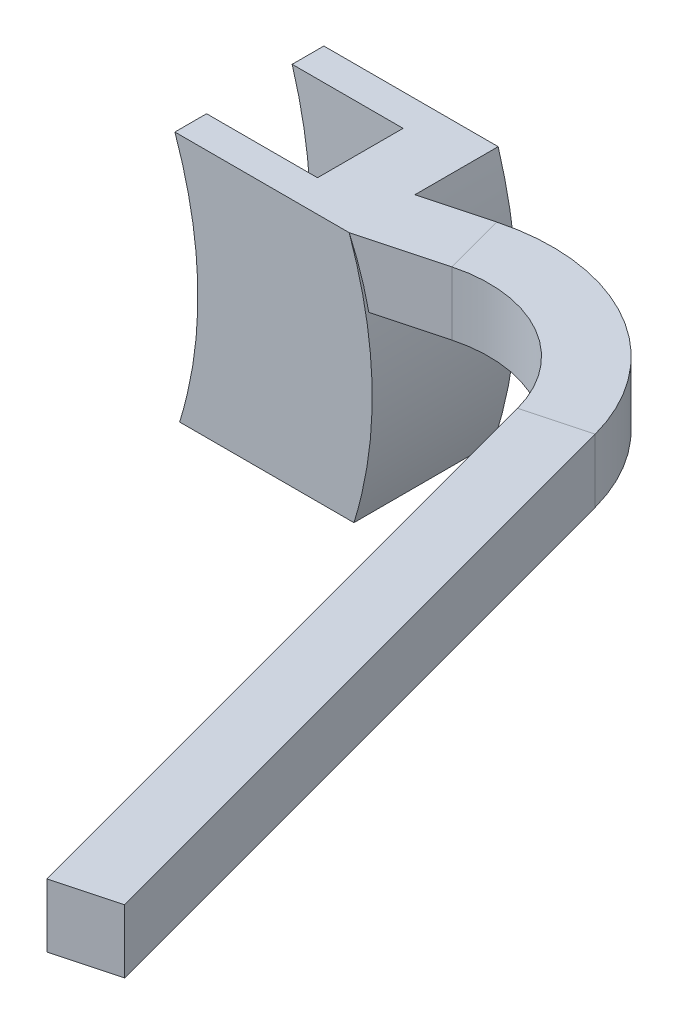
ISO-10303-21;
HEADER;
FILE_DESCRIPTION(('STEP AP214'),'2;1');
FILE_NAME('part.step','',(''),(''),'','','');
FILE_SCHEMA(('AUTOMOTIVE_DESIGN { 1 0 10303 214 1 1 1 1 }'));
ENDSEC;
DATA;
#1=APPLICATION_CONTEXT('core data for automotive mechanical design processes');
#2=APPLICATION_PROTOCOL_DEFINITION('international standard','automotive_design',2000,#1);
#3=PRODUCT_CONTEXT('',#1,'mechanical');
#4=PRODUCT('Part','Part','',(#3));
#5=PRODUCT_RELATED_PRODUCT_CATEGORY('part','',(#4));
#6=PRODUCT_DEFINITION_FORMATION('','',#4);
#7=PRODUCT_DEFINITION_CONTEXT('part definition',#1,'design');
#8=PRODUCT_DEFINITION('design','',#6,#7);
#9=PRODUCT_DEFINITION_SHAPE('','',#8);
#10=(LENGTH_UNIT() NAMED_UNIT(*) SI_UNIT(.MILLI.,.METRE.));
#11=(NAMED_UNIT(*) PLANE_ANGLE_UNIT() SI_UNIT($,.RADIAN.));
#12=(NAMED_UNIT(*) SI_UNIT($,.STERADIAN.) SOLID_ANGLE_UNIT());
#13=UNCERTAINTY_MEASURE_WITH_UNIT(LENGTH_MEASURE(1.E-05),#10,'distance_accuracy_value','');
#14=(GEOMETRIC_REPRESENTATION_CONTEXT(3) GLOBAL_UNCERTAINTY_ASSIGNED_CONTEXT((#13)) GLOBAL_UNIT_ASSIGNED_CONTEXT((#10,
#11,#12)) REPRESENTATION_CONTEXT('',''));
#15=CARTESIAN_POINT('',(0.,0.,0.));
#16=DIRECTION('',(0.,0.,1.));
#17=DIRECTION('',(1.,0.,0.));
#18=AXIS2_PLACEMENT_3D('',#15,#16,#17);
#19=CARTESIAN_POINT('',(60.,8.,-2.35));
#20=CARTESIAN_POINT('',(60.8653662766584,5.35614845030153,-2.3));
#21=CARTESIAN_POINT('',(60.8653662766584,2.68948178363486,-2.25));
#22=CARTESIAN_POINT('',(60.,0.,-2.2));
#23=CARTESIAN_POINT('',(60.,8.,-2.15863730934751));
#24=CARTESIAN_POINT('',(60.8653662766584,5.35614845030153,-2.10985617998861));
#25=CARTESIAN_POINT('',(60.8653662766584,2.68948178363486,-2.06107505062971));
#26=CARTESIAN_POINT('',(60.,0.,-2.01229392127081));
#27=CARTESIAN_POINT('',(60.,8.00000000000001,-1.77161936252816));
#28=CARTESIAN_POINT('',(60.8653662766584,5.35614845030153,-1.72822431693921));
#29=CARTESIAN_POINT('',(60.8653662766583,2.68948178363486,-1.68482927135026));
#30=CARTESIAN_POINT('',(60.,0.,-1.6414342257613));
#31=CARTESIAN_POINT('',(60.,8.,-1.18249968399532));
#32=CARTESIAN_POINT('',(60.8653662766584,5.35614845030153,-1.15270610701582));
#33=CARTESIAN_POINT('',(60.8653662766584,2.68948178363486,-1.12291253003631));
#34=CARTESIAN_POINT('',(60.0000000000001,0.,-1.09311895305681));
#35=CARTESIAN_POINT('',(60.,8.,-0.589800826985092));
#36=CARTESIAN_POINT('',(60.8653662766583,5.35614845030153,-0.575826239457545));
#37=CARTESIAN_POINT('',(60.8653662766583,2.68948178363486,-0.561851651929998));
#38=CARTESIAN_POINT('',(59.9999999999999,0.,-0.547877064402452));
#39=CARTESIAN_POINT('',(60.,8.,-0.195833333333333));
#40=CARTESIAN_POINT('',(60.8653662766584,5.35614845030153,-0.191666666666666));
#41=CARTESIAN_POINT('',(60.8653662766584,2.68948178363486,-0.1875));
#42=CARTESIAN_POINT('',(60.,0.,-0.183333333333334));
#43=CARTESIAN_POINT('',(60.,8.,0.195833333333333));
#44=CARTESIAN_POINT('',(60.8653662766584,5.35614845030153,0.191666666666667));
#45=CARTESIAN_POINT('',(60.8653662766584,2.68948178363486,0.1875));
#46=CARTESIAN_POINT('',(60.,0.,0.183333333333333));
#47=CARTESIAN_POINT('',(60.,8.,0.589800826985092));
#48=CARTESIAN_POINT('',(60.8653662766584,5.35614845030153,0.575826239457545));
#49=CARTESIAN_POINT('',(60.8653662766584,2.68948178363486,0.561851651929998));
#50=CARTESIAN_POINT('',(60.,0.,0.547877064402451));
#51=CARTESIAN_POINT('',(59.9999999999999,7.99999999999999,1.18249968399532));
#52=CARTESIAN_POINT('',(60.8653662766583,5.35614845030153,1.15270610701582));
#53=CARTESIAN_POINT('',(60.8653662766583,2.68948178363486,1.12291253003631));
#54=CARTESIAN_POINT('',(59.9999999999999,0.,1.09311895305681));
#55=CARTESIAN_POINT('',(60.,8.,1.77161936252816));
#56=CARTESIAN_POINT('',(60.8653662766584,5.35614845030153,1.72822431693921));
#57=CARTESIAN_POINT('',(60.8653662766584,2.68948178363486,1.68482927135026));
#58=CARTESIAN_POINT('',(60.,0.,1.6414342257613));
#59=CARTESIAN_POINT('',(60.,8.,2.15863730934751));
#60=CARTESIAN_POINT('',(60.8653662766584,5.35614845030153,2.10985617998861));
#61=CARTESIAN_POINT('',(60.8653662766584,2.68948178363486,2.06107505062971));
#62=CARTESIAN_POINT('',(60.,0.,2.01229392127081));
#63=CARTESIAN_POINT('',(60.,8.,2.35));
#64=CARTESIAN_POINT('',(60.8653662766584,5.35614845030153,2.3));
#65=CARTESIAN_POINT('',(60.8653662766584,2.68948178363486,2.25));
#66=CARTESIAN_POINT('',(60.,0.,2.2));
#67=B_SPLINE_SURFACE_WITH_KNOTS('',3,3,((#19,#20,#21,#22),(#23,#24,#25,#26),(#27,#28,#29,#30),
(#31,#32,#33,#34),(#35,#36,#37,#38),(#39,#40,#41,#42),(#43,#44,#45,#46),(#47,#48,#49,#50),(#51,
#52,#53,#54),(#55,#56,#57,#58),(#59,#60,#61,#62),(#63,#64,#65,#66)),.UNSPECIFIED.,.F.,.F.,.F.,
(4,1,1,1,2,1,1,1,4),(4,4),(0.83214402440353,0.853126021353088,0.874108018302647,
0.895090015252206,0.916072012201765,0.937054009151324,0.958036006100883,0.979018003050441,1.),
(0.,1.),.UNSPECIFIED.);
#68=CARTESIAN_POINT('',(60.,8.,0.279447639179836));
#69=CARTESIAN_POINT('',(60.0185057934818,7.94346027569522,0.274489026761094));
#70=CARTESIAN_POINT('',(60.0366528022548,7.88679890092884,0.26962655041533));
#71=CARTESIAN_POINT('',(60.0722092345142,7.7732629079176,0.260099233105677));
#72=CARTESIAN_POINT('',(60.0896190558483,7.7163884232008,0.25543428553884));
#73=CARTESIAN_POINT('',(60.1878100093424,7.38797227791177,0.229124098846057));
#74=CARTESIAN_POINT('',(60.2605996129861,7.11377513304997,0.209620183332324));
#75=CARTESIAN_POINT('',(60.3564062785034,6.69885713464405,0.183948864677482));
#76=CARTESIAN_POINT('',(60.3861439343748,6.55975314114146,0.175980683801943));
#77=CARTESIAN_POINT('',(60.4409943526686,6.28057615679556,0.161283558515574));
#78=CARTESIAN_POINT('',(60.4661072544184,6.1405031952758,0.154554576772033));
#79=CARTESIAN_POINT('',(60.4888530247303,6.0000000000001,0.148459865985583));
#80=B_SPLINE_CURVE_WITH_KNOTS('',3,(#68,#69,#70,#71,#72,#73,#74,#75,#76,#77,#78,#79),
.UNSPECIFIED.,.F.,.F.,(4,2,2,2,2,4),(0.,0.179083188638232,0.358068464130375,1.21039474833497,
1.63773780272449,2.0650679806646),.UNSPECIFIED.);
#81=CARTESIAN_POINT('',(60.,8.,0.279447639179836));
#82=VERTEX_POINT('',#81);
#83=CARTESIAN_POINT('',(60.4888530247303,6.,0.148459865985832));
#84=VERTEX_POINT('',#83);
#85=EDGE_CURVE('E384',#82,#84,#80,.T.);
#86=CARTESIAN_POINT('',(60.4888530247303,6.,-0.281466905471393));
#87=CARTESIAN_POINT('',(60.4888530247303,6.,-0.110970857043158));
#88=CARTESIAN_POINT('',(60.4888530247303,6.,0.0595251913850771));
#89=CARTESIAN_POINT('',(60.4888530247303,6.,0.92410027366506));
#90=CARTESIAN_POINT('',(60.4888530247303,6.,1.61817930751681));
#91=CARTESIAN_POINT('',(60.4888530247303,6.00000000000001,2.31225834136856));
#92=B_SPLINE_CURVE_WITH_KNOTS('',3,(#86,#87,#88,#89,#90,#91),.UNSPECIFIED.,.F.,.F.,(4,2,4),(0.,
0.511488145284705,2.59372524683995),.UNSPECIFIED.);
#93=CARTESIAN_POINT('',(60.4888530247303,6.,2.21901222679075));
#94=VERTEX_POINT('',#93);
#95=EDGE_CURVE('E188',#84,#94,#92,.T.);
#96=CARTESIAN_POINT('',(60.4888530247303,6.,2.219012226806));
#97=CARTESIAN_POINT('',(60.4750934754549,6.08499169852877,2.22269908692256));
#98=CARTESIAN_POINT('',(60.4604670232459,6.16983252703104,2.2266182329801));
#99=CARTESIAN_POINT('',(60.4295243899598,6.33907463252786,2.23490928658081));
#100=CARTESIAN_POINT('',(60.4132103216062,6.42347632344651,2.23928062802142));
#101=CARTESIAN_POINT('',(60.3789161667889,6.59184502243025,2.24846971910981));
#102=CARTESIAN_POINT('',(60.3609374314628,6.67581232561842,2.25328710672137));
#103=CARTESIAN_POINT('',(60.3233378082954,6.84331748940242,2.26336189538481));
#104=CARTESIAN_POINT('',(60.3037175597146,6.92685550384898,2.26861912514732));
#105=CARTESIAN_POINT('',(60.2628592162098,7.09350254879472,2.27956708529352));
#106=CARTESIAN_POINT('',(60.2416211882671,7.17661159690258,2.28525779772958));
#107=CARTESIAN_POINT('',(60.1975486094574,7.34241222084885,2.29706700962999));
#108=CARTESIAN_POINT('',(60.1747133903412,7.42510360623901,2.30318568815118));
#109=CARTESIAN_POINT('',(60.1274680172645,7.59007543359078,2.3158450477132));
#110=CARTESIAN_POINT('',(60.1030566013437,7.67235548799314,2.32238606689526));
#111=CARTESIAN_POINT('',(60.0526801347878,7.83651157888434,2.33588440042644));
#112=CARTESIAN_POINT('',(60.0267132793032,7.9183870218444,2.34284219838352));
#113=CARTESIAN_POINT('',(60.,8.,2.35));
#114=B_SPLINE_CURVE_WITH_KNOTS('',3,(#96,#97,#98,#99,#100,#101,#102,#103,#104,#105,#106,#107,
#108,#109,#110,#111,#112,#113),.UNSPECIFIED.,.F.,.F.,(4,2,2,2,2,2,2,2,4),(0.,0.258526098845663,
0.516732378748518,0.774730890928317,1.03262939333222,1.29051722367512,1.54851360474685,
1.80671917178633,2.06523037953004),.UNSPECIFIED.);
#115=CARTESIAN_POINT('',(60.,8.,2.35));
#116=VERTEX_POINT('',#115);
#117=EDGE_CURVE('E385',#94,#116,#114,.T.);
#118=CARTESIAN_POINT('',(60.,8.,2.35));
#119=CARTESIAN_POINT('',(60.8653662766584,5.35614845030153,2.3));
#120=CARTESIAN_POINT('',(60.8653662766584,2.68948178363486,2.25));
#121=CARTESIAN_POINT('',(60.,0.,2.2));
#122=B_SPLINE_CURVE_WITH_KNOTS('',3,(#118,#119,#120,#121),.UNSPECIFIED.,.F.,.F.,(4,4),(0.,1.),.UNSPECIFIED.);
#123=CARTESIAN_POINT('',(60.,0.,2.2));
#124=VERTEX_POINT('',#123);
#125=EDGE_CURVE('E978',#116,#124,#122,.T.);
#126=DIRECTION('',(0.,0.,-1.));
#127=VECTOR('',#126,1.);
#128=CARTESIAN_POINT('',(60.,0.,2.2));
#129=LINE('',#128,#127);
#130=CARTESIAN_POINT('',(60.,0.,-2.2));
#131=VERTEX_POINT('',#130);
#132=EDGE_CURVE('E13',#124,#131,#129,.T.);
#133=CARTESIAN_POINT('',(60.,8.,-2.35));
#134=CARTESIAN_POINT('',(60.8653662766584,5.35614845030153,-2.3));
#135=CARTESIAN_POINT('',(60.8653662766584,2.68948178363486,-2.25));
#136=CARTESIAN_POINT('',(60.,0.,-2.2));
#137=B_SPLINE_CURVE_WITH_KNOTS('',3,(#133,#134,#135,#136),.UNSPECIFIED.,.F.,.F.,(4,4),(0.,1.),.UNSPECIFIED.);
#138=CARTESIAN_POINT('',(60.,8.,-2.35));
#139=VERTEX_POINT('',#138);
#140=EDGE_CURVE('E529',#139,#131,#137,.T.);
#141=DIRECTION('',(0.,0.,-1.));
#142=VECTOR('',#141,1.);
#143=CARTESIAN_POINT('',(60.,8.,2.35));
#144=LINE('',#143,#142);
#145=EDGE_CURVE('E596',#82,#139,#144,.T.);
#146=ORIENTED_EDGE('',*,*,#85,.T.);
#147=ORIENTED_EDGE('',*,*,#95,.T.);
#148=ORIENTED_EDGE('',*,*,#117,.T.);
#149=ORIENTED_EDGE('',*,*,#125,.T.);
#150=ORIENTED_EDGE('',*,*,#132,.T.);
#151=ORIENTED_EDGE('',*,*,#140,.F.);
#152=ORIENTED_EDGE('',*,*,#145,.F.);
#153=EDGE_LOOP('',(#146,#147,#148,#149,#150,#151,#152));
#154=FACE_BOUND('',#153,.T.);
#155=ADVANCED_FACE('F169',(#154),#67,.T.);
#156=CARTESIAN_POINT('',(0.,0.,0.));
#157=DIRECTION('',(0.,1.,0.));
#158=DIRECTION('',(0.,0.,1.));
#159=AXIS2_PLACEMENT_3D('',#156,#157,#158);
#160=PLANE('',#159);
#161=DIRECTION('',(-1.,0.,0.));
#162=VECTOR('',#161,1.);
#163=CARTESIAN_POINT('',(60.,0.,-2.2));
#164=LINE('',#163,#162);
#165=CARTESIAN_POINT('',(54.5,0.,-2.2));
#166=VERTEX_POINT('',#165);
#167=EDGE_CURVE('E585',#131,#166,#164,.T.);
#168=ORIENTED_EDGE('',*,*,#167,.F.);
#169=ORIENTED_EDGE('',*,*,#132,.F.);
#170=DIRECTION('',(1.,0.,0.));
#171=VECTOR('',#170,1.);
#172=CARTESIAN_POINT('',(54.5,0.,2.2));
#173=LINE('',#172,#171);
#174=CARTESIAN_POINT('',(54.5,0.,2.2));
#175=VERTEX_POINT('',#174);
#176=EDGE_CURVE('E180',#175,#124,#173,.T.);
#177=ORIENTED_EDGE('',*,*,#176,.F.);
#178=DIRECTION('',(0.,0.,1.));
#179=VECTOR('',#178,1.);
#180=CARTESIAN_POINT('',(54.5,0.,1.2));
#181=LINE('',#180,#179);
#182=CARTESIAN_POINT('',(54.5,0.,1.2));
#183=VERTEX_POINT('',#182);
#184=EDGE_CURVE('E653',#183,#175,#181,.T.);
#185=ORIENTED_EDGE('',*,*,#184,.F.);
#186=DIRECTION('',(-1.,0.,0.));
#187=VECTOR('',#186,1.);
#188=CARTESIAN_POINT('',(58.,0.,1.2));
#189=LINE('',#188,#187);
#190=CARTESIAN_POINT('',(58.,0.,1.2));
#191=VERTEX_POINT('',#190);
#192=EDGE_CURVE('E770',#191,#183,#189,.T.);
#193=ORIENTED_EDGE('',*,*,#192,.F.);
#194=DIRECTION('',(0.,0.,1.));
#195=VECTOR('',#194,1.);
#196=CARTESIAN_POINT('',(58.,0.,-1.2));
#197=LINE('',#196,#195);
#198=CARTESIAN_POINT('',(58.,0.,-1.2));
#199=VERTEX_POINT('',#198);
#200=EDGE_CURVE('E766',#199,#191,#197,.T.);
#201=ORIENTED_EDGE('',*,*,#200,.F.);
#202=DIRECTION('',(1.,0.,0.));
#203=VECTOR('',#202,1.);
#204=CARTESIAN_POINT('',(54.5,0.,-1.2));
#205=LINE('',#204,#203);
#206=CARTESIAN_POINT('',(54.5,0.,-1.2));
#207=VERTEX_POINT('',#206);
#208=EDGE_CURVE('E755',#207,#199,#205,.T.);
#209=ORIENTED_EDGE('',*,*,#208,.F.);
#210=DIRECTION('',(0.,0.,1.));
#211=VECTOR('',#210,1.);
#212=CARTESIAN_POINT('',(54.5,0.,-2.2));
#213=LINE('',#212,#211);
#214=EDGE_CURVE('E522',#166,#207,#213,.T.);
#215=ORIENTED_EDGE('',*,*,#214,.F.);
#216=EDGE_LOOP('',(#168,#169,#177,#185,#193,#201,#209,#215));
#217=FACE_BOUND('',#216,.T.);
#218=ADVANCED_FACE('F171',(#217),#160,.F.);
#219=CARTESIAN_POINT('',(0.,8.,0.));
#220=DIRECTION('',(0.,1.,0.));
#221=DIRECTION('',(0.,0.,1.));
#222=AXIS2_PLACEMENT_3D('',#219,#220,#221);
#223=PLANE('',#222);
#224=DIRECTION('',(-1.,0.,0.));
#225=VECTOR('',#224,1.);
#226=CARTESIAN_POINT('',(60.,8.,-2.35));
#227=LINE('',#226,#225);
#228=CARTESIAN_POINT('',(54.5,8.,-2.35));
#229=VERTEX_POINT('',#228);
#230=EDGE_CURVE('E493',#139,#229,#227,.T.);
#231=ORIENTED_EDGE('',*,*,#230,.T.);
#232=DIRECTION('',(0.,0.,1.));
#233=VECTOR('',#232,1.);
#234=CARTESIAN_POINT('',(54.5,8.,-2.35));
#235=LINE('',#234,#233);
#236=CARTESIAN_POINT('',(54.5,8.,-1.35));
#237=VERTEX_POINT('',#236);
#238=EDGE_CURVE('E484',#229,#237,#235,.T.);
#239=ORIENTED_EDGE('',*,*,#238,.T.);
#240=DIRECTION('',(1.,0.,0.));
#241=VECTOR('',#240,1.);
#242=CARTESIAN_POINT('',(54.5,8.,-1.35));
#243=LINE('',#242,#241);
#244=CARTESIAN_POINT('',(58.,8.,-1.35));
#245=VERTEX_POINT('',#244);
#246=EDGE_CURVE('E492',#237,#245,#243,.T.);
#247=ORIENTED_EDGE('',*,*,#246,.T.);
#248=DIRECTION('',(0.,0.,1.));
#249=VECTOR('',#248,1.);
#250=CARTESIAN_POINT('',(58.,8.,-1.35));
#251=LINE('',#250,#249);
#252=CARTESIAN_POINT('',(58.,8.,1.35));
#253=VERTEX_POINT('',#252);
#254=EDGE_CURVE('E499',#245,#253,#251,.T.);
#255=ORIENTED_EDGE('',*,*,#254,.T.);
#256=DIRECTION('',(-1.,0.,0.));
#257=VECTOR('',#256,1.);
#258=CARTESIAN_POINT('',(58.,8.,1.35));
#259=LINE('',#258,#257);
#260=CARTESIAN_POINT('',(54.5,8.,1.35));
#261=VERTEX_POINT('',#260);
#262=EDGE_CURVE('E705',#253,#261,#259,.T.);
#263=ORIENTED_EDGE('',*,*,#262,.T.);
#264=DIRECTION('',(0.,0.,1.));
#265=VECTOR('',#264,1.);
#266=CARTESIAN_POINT('',(54.5,8.,1.35));
#267=LINE('',#266,#265);
#268=CARTESIAN_POINT('',(54.5,8.,2.35));
#269=VERTEX_POINT('',#268);
#270=EDGE_CURVE('E776',#261,#269,#267,.T.);
#271=ORIENTED_EDGE('',*,*,#270,.T.);
#272=DIRECTION('',(1.,0.,0.));
#273=VECTOR('',#272,1.);
#274=CARTESIAN_POINT('',(54.5,8.,2.35));
#275=LINE('',#274,#273);
#276=EDGE_CURVE('E600',#269,#116,#275,.T.);
#277=ORIENTED_EDGE('',*,*,#276,.T.);
#278=DIRECTION('',(0.965925826289068,0.,-0.258819045102521));
#279=VECTOR('',#278,1.);
#280=CARTESIAN_POINT('',(54.8671288256207,8.,3.72534868602793));
#281=LINE('',#280,#279);
#282=CARTESIAN_POINT('',(62.5561499485117,8.,1.66508168556344));
#283=VERTEX_POINT('',#282);
#284=EDGE_CURVE('E791',#116,#283,#281,.T.);
#285=ORIENTED_EDGE('',*,*,#284,.T.);
#286=DIRECTION('',(0.258819045102519,0.,0.965925826289069));
#287=VECTOR('',#286,1.);
#288=CARTESIAN_POINT('',(62.0385118583067,8.,-0.2667699670147));
#289=LINE('',#288,#287);
#290=CARTESIAN_POINT('',(62.0385118583067,8.,-0.266769967014695));
#291=VERTEX_POINT('',#290);
#292=EDGE_CURVE('E317',#291,#283,#289,.T.);
#293=ORIENTED_EDGE('',*,*,#292,.F.);
#294=DIRECTION('',(0.965925826289068,0.,-0.258819045102521));
#295=VECTOR('',#294,1.);
#296=CARTESIAN_POINT('',(54.3494907354157,8.,1.79349703344979));
#297=LINE('',#296,#295);
#298=EDGE_CURVE('E314',#82,#291,#297,.T.);
#299=ORIENTED_EDGE('',*,*,#298,.F.);
#300=ORIENTED_EDGE('',*,*,#145,.T.);
#301=EDGE_LOOP('',(#231,#239,#247,#255,#263,#271,#277,#285,#293,#299,#300));
#302=FACE_BOUND('',#301,.T.);
#303=ADVANCED_FACE('F428',(#302),#223,.T.);
#304=CARTESIAN_POINT('',(54.5,8.,-2.35));
#305=CARTESIAN_POINT('',(55.3653662766584,5.35614845030153,-2.3));
#306=CARTESIAN_POINT('',(55.3653662766583,2.68948178363486,-2.25));
#307=CARTESIAN_POINT('',(54.5,0.,-2.2));
#308=CARTESIAN_POINT('',(54.9583333333333,8.,-2.35));
#309=CARTESIAN_POINT('',(55.8236996099917,5.35614845030153,-2.3));
#310=CARTESIAN_POINT('',(55.8236996099917,2.68948178363486,-2.25));
#311=CARTESIAN_POINT('',(54.9583333333333,0.,-2.2));
#312=CARTESIAN_POINT('',(55.8750000000001,8.00000000000001,-2.35));
#313=CARTESIAN_POINT('',(56.7403662766585,5.35614845030153,-2.3));
#314=CARTESIAN_POINT('',(56.7403662766584,2.68948178363486,-2.25));
#315=CARTESIAN_POINT('',(55.8750000000001,0.,-2.2));
#316=CARTESIAN_POINT('',(57.2499999999999,8.,-2.35));
#317=CARTESIAN_POINT('',(58.1153662766582,5.35614845030153,-2.3));
#318=CARTESIAN_POINT('',(58.1153662766582,2.68948178363486,-2.25));
#319=CARTESIAN_POINT('',(57.2499999999999,0.,-2.2));
#320=CARTESIAN_POINT('',(58.6250000000001,8.,-2.35));
#321=CARTESIAN_POINT('',(59.4903662766585,5.35614845030153,-2.3));
#322=CARTESIAN_POINT('',(59.4903662766585,2.68948178363486,-2.25));
#323=CARTESIAN_POINT('',(58.6250000000001,0.,-2.2));
#324=CARTESIAN_POINT('',(59.5416666666667,8.,-2.35));
#325=CARTESIAN_POINT('',(60.407032943325,5.35614845030153,-2.3));
#326=CARTESIAN_POINT('',(60.407032943325,2.68948178363486,-2.25));
#327=CARTESIAN_POINT('',(59.5416666666667,0.,-2.2));
#328=CARTESIAN_POINT('',(60.,8.,-2.35));
#329=CARTESIAN_POINT('',(60.8653662766584,5.35614845030153,-2.3));
#330=CARTESIAN_POINT('',(60.8653662766584,2.68948178363486,-2.25));
#331=CARTESIAN_POINT('',(60.,0.,-2.2));
#332=B_SPLINE_SURFACE_WITH_KNOTS('',3,3,((#304,#305,#306,#307),(#308,#309,#310,#311),(#312,#313,
#314,#315),(#316,#317,#318,#319),(#320,#321,#322,#323),(#324,#325,#326,#327),(#328,#329,#330,
#331)),.UNSPECIFIED.,.F.,.F.,.F.,(4,1,1,1,4),(4,4),(0.629167120601373,0.679911346551912,
0.730655572502451,0.781399798452991,0.83214402440353),(0.,1.),.UNSPECIFIED.);
#333=CARTESIAN_POINT('',(54.5,8.,-2.35));
#334=CARTESIAN_POINT('',(55.3653662766584,5.35614845030153,-2.3));
#335=CARTESIAN_POINT('',(55.3653662766583,2.68948178363486,-2.25));
#336=CARTESIAN_POINT('',(54.5,0.,-2.2));
#337=B_SPLINE_CURVE_WITH_KNOTS('',3,(#333,#334,#335,#336),.UNSPECIFIED.,.F.,.F.,(4,4),(0.,1.),.UNSPECIFIED.);
#338=EDGE_CURVE('E525',#229,#166,#337,.T.);
#339=ORIENTED_EDGE('',*,*,#230,.F.);
#340=ORIENTED_EDGE('',*,*,#140,.T.);
#341=ORIENTED_EDGE('',*,*,#167,.T.);
#342=ORIENTED_EDGE('',*,*,#338,.F.);
#343=EDGE_LOOP('',(#339,#340,#341,#342));
#344=FACE_BOUND('',#343,.T.);
#345=ADVANCED_FACE('F432',(#344),#332,.T.);
#346=CARTESIAN_POINT('',(54.5,8.,-1.35));
#347=CARTESIAN_POINT('',(55.3653662766584,5.35614845030153,-1.3));
#348=CARTESIAN_POINT('',(55.3653662766583,2.68948178363486,-1.25));
#349=CARTESIAN_POINT('',(54.5,0.,-1.2));
#350=CARTESIAN_POINT('',(54.5,8.,-1.43333333333333));
#351=CARTESIAN_POINT('',(55.3653662766584,5.35614845030153,-1.38333333333333));
#352=CARTESIAN_POINT('',(55.3653662766583,2.68948178363486,-1.33333333333333));
#353=CARTESIAN_POINT('',(54.5,0.,-1.28333333333333));
#354=CARTESIAN_POINT('',(54.5,7.99999999999999,-1.6));
#355=CARTESIAN_POINT('',(55.3653662766583,5.35614845030153,-1.55));
#356=CARTESIAN_POINT('',(55.3653662766583,2.68948178363486,-1.5));
#357=CARTESIAN_POINT('',(54.5,0.,-1.45));
#358=CARTESIAN_POINT('',(54.5,8.00000000000001,-1.85));
#359=CARTESIAN_POINT('',(55.3653662766583,5.35614845030153,-1.8));
#360=CARTESIAN_POINT('',(55.3653662766583,2.68948178363486,-1.75));
#361=CARTESIAN_POINT('',(54.5,0.,-1.7));
#362=CARTESIAN_POINT('',(54.5,7.99999999999999,-2.1));
#363=CARTESIAN_POINT('',(55.3653662766584,5.35614845030153,-2.05));
#364=CARTESIAN_POINT('',(55.3653662766584,2.68948178363486,-2.));
#365=CARTESIAN_POINT('',(54.5,0.,-1.95));
#366=CARTESIAN_POINT('',(54.5,8.,-2.26666666666667));
#367=CARTESIAN_POINT('',(55.3653662766584,5.35614845030153,-2.21666666666667));
#368=CARTESIAN_POINT('',(55.3653662766583,2.68948178363486,-2.16666666666667));
#369=CARTESIAN_POINT('',(54.5,0.,-2.11666666666667));
#370=CARTESIAN_POINT('',(54.5,8.,-2.35));
#371=CARTESIAN_POINT('',(55.3653662766584,5.35614845030153,-2.3));
#372=CARTESIAN_POINT('',(55.3653662766583,2.68948178363486,-2.25));
#373=CARTESIAN_POINT('',(54.5,0.,-2.2));
#374=B_SPLINE_SURFACE_WITH_KNOTS('',3,3,((#346,#347,#348,#349),(#350,#351,#352,#353),(#354,#355,
#356,#357),(#358,#359,#360,#361),(#362,#363,#364,#365),(#366,#367,#368,#369),(#370,#371,#372,
#373)),.UNSPECIFIED.,.F.,.F.,.F.,(4,1,1,1,4),(4,4),(0.59226222900098,0.601488451901079,
0.610714674801177,0.619940897701275,0.629167120601373),(0.,1.),.UNSPECIFIED.);
#375=CARTESIAN_POINT('',(54.5,8.,-1.35));
#376=CARTESIAN_POINT('',(55.3653662766584,5.35614845030153,-1.3));
#377=CARTESIAN_POINT('',(55.3653662766583,2.68948178363486,-1.25));
#378=CARTESIAN_POINT('',(54.5,0.,-1.2));
#379=B_SPLINE_CURVE_WITH_KNOTS('',3,(#375,#376,#377,#378),.UNSPECIFIED.,.F.,.F.,(4,4),(0.,1.),.UNSPECIFIED.);
#380=EDGE_CURVE('E511',#237,#207,#379,.T.);
#381=ORIENTED_EDGE('',*,*,#238,.F.);
#382=ORIENTED_EDGE('',*,*,#338,.T.);
#383=ORIENTED_EDGE('',*,*,#214,.T.);
#384=ORIENTED_EDGE('',*,*,#380,.F.);
#385=EDGE_LOOP('',(#381,#382,#383,#384));
#386=FACE_BOUND('',#385,.T.);
#387=ADVANCED_FACE('F518',(#386),#374,.T.);
#388=CARTESIAN_POINT('',(58.,8.,-1.35));
#389=CARTESIAN_POINT('',(58.8653662766584,5.35614845030153,-1.3));
#390=CARTESIAN_POINT('',(58.8653662766584,2.68948178363486,-1.25));
#391=CARTESIAN_POINT('',(58.,0.,-1.2));
#392=CARTESIAN_POINT('',(57.7083333333333,8.,-1.35));
#393=CARTESIAN_POINT('',(58.5736996099917,5.35614845030153,-1.3));
#394=CARTESIAN_POINT('',(58.5736996099917,2.68948178363486,-1.25));
#395=CARTESIAN_POINT('',(57.7083333333333,0.,-1.2));
#396=CARTESIAN_POINT('',(57.1249999999999,7.99999999999999,-1.35));
#397=CARTESIAN_POINT('',(57.9903662766583,5.35614845030152,-1.3));
#398=CARTESIAN_POINT('',(57.9903662766583,2.68948178363486,-1.25));
#399=CARTESIAN_POINT('',(57.1249999999999,0.,-1.2));
#400=CARTESIAN_POINT('',(56.25,8.00000000000001,-1.35));
#401=CARTESIAN_POINT('',(57.1153662766584,5.35614845030154,-1.3));
#402=CARTESIAN_POINT('',(57.1153662766584,2.68948178363487,-1.25));
#403=CARTESIAN_POINT('',(56.25,0.,-1.2));
#404=CARTESIAN_POINT('',(55.3749999999999,7.99999999999999,-1.35));
#405=CARTESIAN_POINT('',(56.2403662766583,5.35614845030152,-1.3));
#406=CARTESIAN_POINT('',(56.2403662766583,2.68948178363486,-1.25));
#407=CARTESIAN_POINT('',(55.3749999999999,0.,-1.2));
#408=CARTESIAN_POINT('',(54.7916666666667,8.,-1.35));
#409=CARTESIAN_POINT('',(55.657032943325,5.35614845030153,-1.3));
#410=CARTESIAN_POINT('',(55.657032943325,2.68948178363486,-1.25));
#411=CARTESIAN_POINT('',(54.7916666666667,0.,-1.2));
#412=CARTESIAN_POINT('',(54.5,8.,-1.35));
#413=CARTESIAN_POINT('',(55.3653662766584,5.35614845030153,-1.3));
#414=CARTESIAN_POINT('',(55.3653662766583,2.68948178363486,-1.25));
#415=CARTESIAN_POINT('',(54.5,0.,-1.2));
#416=B_SPLINE_SURFACE_WITH_KNOTS('',3,3,((#388,#389,#390,#391),(#392,#393,#394,#395),(#396,#397,
#398,#399),(#400,#401,#402,#403),(#404,#405,#406,#407),(#408,#409,#410,#411),(#412,#413,#414,
#415)),.UNSPECIFIED.,.F.,.F.,.F.,(4,1,1,1,4),(4,4),(0.463095108399608,0.495386888549951,
0.527678668700294,0.559970448850637,0.59226222900098),(0.,1.),.UNSPECIFIED.);
#417=CARTESIAN_POINT('',(58.,8.,-1.35));
#418=CARTESIAN_POINT('',(58.8653662766584,5.35614845030153,-1.3));
#419=CARTESIAN_POINT('',(58.8653662766584,2.68948178363486,-1.25));
#420=CARTESIAN_POINT('',(58.,0.,-1.2));
#421=B_SPLINE_CURVE_WITH_KNOTS('',3,(#417,#418,#419,#420),.UNSPECIFIED.,.F.,.F.,(4,4),(0.,1.),.UNSPECIFIED.);
#422=EDGE_CURVE('E513',#245,#199,#421,.T.);
#423=ORIENTED_EDGE('',*,*,#246,.F.);
#424=ORIENTED_EDGE('',*,*,#380,.T.);
#425=ORIENTED_EDGE('',*,*,#208,.T.);
#426=ORIENTED_EDGE('',*,*,#422,.F.);
#427=EDGE_LOOP('',(#423,#424,#425,#426));
#428=FACE_BOUND('',#427,.T.);
#429=ADVANCED_FACE('F509',(#428),#416,.T.);
#430=CARTESIAN_POINT('',(58.,8.,1.35));
#431=CARTESIAN_POINT('',(58.8653662766584,5.35614845030153,1.3));
#432=CARTESIAN_POINT('',(58.8653662766584,2.68948178363486,1.25));
#433=CARTESIAN_POINT('',(58.,0.,1.2));
#434=CARTESIAN_POINT('',(58.,8.,1.125));
#435=CARTESIAN_POINT('',(58.8653662766584,5.35614845030153,1.08333333333333));
#436=CARTESIAN_POINT('',(58.8653662766584,2.68948178363486,1.04166666666667));
#437=CARTESIAN_POINT('',(58.,0.,1.));
#438=CARTESIAN_POINT('',(58.0000000000001,8.,0.675));
#439=CARTESIAN_POINT('',(58.8653662766584,5.35614845030153,0.65));
#440=CARTESIAN_POINT('',(58.8653662766584,2.68948178363486,0.625000000000001));
#441=CARTESIAN_POINT('',(58.0000000000001,0.,0.600000000000001));
#442=CARTESIAN_POINT('',(57.9999999999999,8.,0.));
#443=CARTESIAN_POINT('',(58.8653662766583,5.35614845030153,0.));
#444=CARTESIAN_POINT('',(58.8653662766583,2.68948178363486,0.));
#445=CARTESIAN_POINT('',(57.9999999999999,0.,0.));
#446=CARTESIAN_POINT('',(58.0000000000001,8.,-0.675000000000001));
#447=CARTESIAN_POINT('',(58.8653662766584,5.35614845030153,-0.65));
#448=CARTESIAN_POINT('',(58.8653662766584,2.68948178363486,-0.625));
#449=CARTESIAN_POINT('',(58.0000000000001,0.,-0.6));
#450=CARTESIAN_POINT('',(58.,8.,-1.125));
#451=CARTESIAN_POINT('',(58.8653662766584,5.35614845030153,-1.08333333333333));
#452=CARTESIAN_POINT('',(58.8653662766584,2.68948178363486,-1.04166666666667));
#453=CARTESIAN_POINT('',(58.,0.,-1.));
#454=CARTESIAN_POINT('',(58.,8.,-1.35));
#455=CARTESIAN_POINT('',(58.8653662766584,5.35614845030153,-1.3));
#456=CARTESIAN_POINT('',(58.8653662766584,2.68948178363486,-1.25));
#457=CARTESIAN_POINT('',(58.,0.,-1.2));
#458=B_SPLINE_SURFACE_WITH_KNOTS('',3,3,((#430,#431,#432,#433),(#434,#435,#436,#437),(#438,#439,
#440,#441),(#442,#443,#444,#445),(#446,#447,#448,#449),(#450,#451,#452,#453),(#454,#455,#456,
#457)),.UNSPECIFIED.,.F.,.F.,.F.,(4,1,1,1,4),(4,4),(0.369048916003922,0.392560464102843,
0.416072012201765,0.439583560300686,0.463095108399608),(0.,1.),.UNSPECIFIED.);
#459=CARTESIAN_POINT('',(58.,8.,1.35));
#460=CARTESIAN_POINT('',(58.8653662766584,5.35614845030153,1.3));
#461=CARTESIAN_POINT('',(58.8653662766584,2.68948178363486,1.25));
#462=CARTESIAN_POINT('',(58.,0.,1.2));
#463=B_SPLINE_CURVE_WITH_KNOTS('',3,(#459,#460,#461,#462),.UNSPECIFIED.,.F.,.F.,(4,4),(0.,1.),.UNSPECIFIED.);
#464=EDGE_CURVE('E531',#253,#191,#463,.T.);
#465=ORIENTED_EDGE('',*,*,#254,.F.);
#466=ORIENTED_EDGE('',*,*,#422,.T.);
#467=ORIENTED_EDGE('',*,*,#200,.T.);
#468=ORIENTED_EDGE('',*,*,#464,.F.);
#469=EDGE_LOOP('',(#465,#466,#467,#468));
#470=FACE_BOUND('',#469,.T.);
#471=ADVANCED_FACE('F728',(#470),#458,.T.);
#472=CARTESIAN_POINT('',(54.5,8.,1.35));
#473=CARTESIAN_POINT('',(55.3653662766584,5.35614845030153,1.3));
#474=CARTESIAN_POINT('',(55.3653662766583,2.68948178363486,1.25));
#475=CARTESIAN_POINT('',(54.5,0.,1.2));
#476=CARTESIAN_POINT('',(54.7916666666667,8.,1.35));
#477=CARTESIAN_POINT('',(55.657032943325,5.35614845030153,1.3));
#478=CARTESIAN_POINT('',(55.657032943325,2.68948178363486,1.25));
#479=CARTESIAN_POINT('',(54.7916666666667,0.,1.2));
#480=CARTESIAN_POINT('',(55.375,7.99999999999999,1.35));
#481=CARTESIAN_POINT('',(56.2403662766583,5.35614845030152,1.3));
#482=CARTESIAN_POINT('',(56.2403662766583,2.68948178363486,1.25));
#483=CARTESIAN_POINT('',(55.375,0.,1.2));
#484=CARTESIAN_POINT('',(56.25,8.00000000000001,1.35));
#485=CARTESIAN_POINT('',(57.1153662766584,5.35614845030154,1.3));
#486=CARTESIAN_POINT('',(57.1153662766584,2.68948178363487,1.25));
#487=CARTESIAN_POINT('',(56.25,0.,1.2));
#488=CARTESIAN_POINT('',(57.125,7.99999999999999,1.35));
#489=CARTESIAN_POINT('',(57.9903662766583,5.35614845030152,1.3));
#490=CARTESIAN_POINT('',(57.9903662766583,2.68948178363486,1.25));
#491=CARTESIAN_POINT('',(57.125,0.,1.2));
#492=CARTESIAN_POINT('',(57.7083333333333,8.,1.35));
#493=CARTESIAN_POINT('',(58.5736996099917,5.35614845030153,1.3));
#494=CARTESIAN_POINT('',(58.5736996099917,2.68948178363486,1.25));
#495=CARTESIAN_POINT('',(57.7083333333333,0.,1.2));
#496=CARTESIAN_POINT('',(58.,8.,1.35));
#497=CARTESIAN_POINT('',(58.8653662766584,5.35614845030153,1.3));
#498=CARTESIAN_POINT('',(58.8653662766584,2.68948178363486,1.25));
#499=CARTESIAN_POINT('',(58.,0.,1.2));
#500=B_SPLINE_SURFACE_WITH_KNOTS('',3,3,((#472,#473,#474,#475),(#476,#477,#478,#479),(#480,#481,
#482,#483),(#484,#485,#486,#487),(#488,#489,#490,#491),(#492,#493,#494,#495),(#496,#497,#498,
#499)),.UNSPECIFIED.,.F.,.F.,.F.,(4,1,1,1,4),(4,4),(0.239881795402549,0.272173575552892,
0.304465355703236,0.336757135853579,0.369048916003922),(0.,1.),.UNSPECIFIED.);
#501=CARTESIAN_POINT('',(54.5,8.,1.35));
#502=CARTESIAN_POINT('',(55.3653662766584,5.35614845030153,1.3));
#503=CARTESIAN_POINT('',(55.3653662766583,2.68948178363486,1.25));
#504=CARTESIAN_POINT('',(54.5,0.,1.2));
#505=B_SPLINE_CURVE_WITH_KNOTS('',3,(#501,#502,#503,#504),.UNSPECIFIED.,.F.,.F.,(4,4),(0.,1.),.UNSPECIFIED.);
#506=EDGE_CURVE('E686',#261,#183,#505,.T.);
#507=ORIENTED_EDGE('',*,*,#262,.F.);
#508=ORIENTED_EDGE('',*,*,#464,.T.);
#509=ORIENTED_EDGE('',*,*,#192,.T.);
#510=ORIENTED_EDGE('',*,*,#506,.F.);
#511=EDGE_LOOP('',(#507,#508,#509,#510));
#512=FACE_BOUND('',#511,.T.);
#513=ADVANCED_FACE('F670',(#512),#500,.T.);
#514=CARTESIAN_POINT('',(54.5,8.,2.35));
#515=CARTESIAN_POINT('',(55.3653662766584,5.35614845030153,2.3));
#516=CARTESIAN_POINT('',(55.3653662766583,2.68948178363486,2.25));
#517=CARTESIAN_POINT('',(54.5,0.,2.2));
#518=CARTESIAN_POINT('',(54.5,8.,2.26666666666667));
#519=CARTESIAN_POINT('',(55.3653662766584,5.35614845030153,2.21666666666667));
#520=CARTESIAN_POINT('',(55.3653662766584,2.68948178363486,2.16666666666667));
#521=CARTESIAN_POINT('',(54.5,0.,2.11666666666667));
#522=CARTESIAN_POINT('',(54.5,8.,2.1));
#523=CARTESIAN_POINT('',(55.3653662766584,5.35614845030153,2.05));
#524=CARTESIAN_POINT('',(55.3653662766584,2.68948178363486,2.));
#525=CARTESIAN_POINT('',(54.5,0.,1.95));
#526=CARTESIAN_POINT('',(54.5,8.,1.85));
#527=CARTESIAN_POINT('',(55.3653662766583,5.35614845030153,1.8));
#528=CARTESIAN_POINT('',(55.3653662766583,2.68948178363486,1.75));
#529=CARTESIAN_POINT('',(54.5,0.,1.7));
#530=CARTESIAN_POINT('',(54.5,8.,1.6));
#531=CARTESIAN_POINT('',(55.3653662766583,5.35614845030153,1.55));
#532=CARTESIAN_POINT('',(55.3653662766583,2.68948178363486,1.5));
#533=CARTESIAN_POINT('',(54.5,0.,1.45));
#534=CARTESIAN_POINT('',(54.5,8.,1.43333333333333));
#535=CARTESIAN_POINT('',(55.3653662766584,5.35614845030153,1.38333333333333));
#536=CARTESIAN_POINT('',(55.3653662766584,2.68948178363486,1.33333333333333));
#537=CARTESIAN_POINT('',(54.5,0.,1.28333333333333));
#538=CARTESIAN_POINT('',(54.5,8.,1.35));
#539=CARTESIAN_POINT('',(55.3653662766584,5.35614845030153,1.3));
#540=CARTESIAN_POINT('',(55.3653662766583,2.68948178363486,1.25));
#541=CARTESIAN_POINT('',(54.5,0.,1.2));
#542=B_SPLINE_SURFACE_WITH_KNOTS('',3,3,((#514,#515,#516,#517),(#518,#519,#520,#521),(#522,#523,
#524,#525),(#526,#527,#528,#529),(#530,#531,#532,#533),(#534,#535,#536,#537),(#538,#539,#540,
#541)),.UNSPECIFIED.,.F.,.F.,.F.,(4,1,1,1,4),(4,4),(0.202976903802157,0.212203126702255,
0.221429349602353,0.230655572502451,0.239881795402549),(0.,1.),.UNSPECIFIED.);
#543=CARTESIAN_POINT('',(54.5,8.,2.35));
#544=CARTESIAN_POINT('',(55.3653662766584,5.35614845030153,2.3));
#545=CARTESIAN_POINT('',(55.3653662766583,2.68948178363486,2.25));
#546=CARTESIAN_POINT('',(54.5,0.,2.2));
#547=B_SPLINE_CURVE_WITH_KNOTS('',3,(#543,#544,#545,#546),.UNSPECIFIED.,.F.,.F.,(4,4),(0.,1.),.UNSPECIFIED.);
#548=EDGE_CURVE('E599',#269,#175,#547,.T.);
#549=ORIENTED_EDGE('',*,*,#270,.F.);
#550=ORIENTED_EDGE('',*,*,#506,.T.);
#551=ORIENTED_EDGE('',*,*,#184,.T.);
#552=ORIENTED_EDGE('',*,*,#548,.F.);
#553=EDGE_LOOP('',(#549,#550,#551,#552));
#554=FACE_BOUND('',#553,.T.);
#555=ADVANCED_FACE('F659',(#554),#542,.T.);
#556=CARTESIAN_POINT('',(60.,8.,2.35));
#557=CARTESIAN_POINT('',(60.8653662766584,5.35614845030153,2.3));
#558=CARTESIAN_POINT('',(60.8653662766584,2.68948178363486,2.25));
#559=CARTESIAN_POINT('',(60.,0.,2.2));
#560=CARTESIAN_POINT('',(59.5416666666667,8.,2.35));
#561=CARTESIAN_POINT('',(60.407032943325,5.35614845030153,2.3));
#562=CARTESIAN_POINT('',(60.407032943325,2.68948178363486,2.25));
#563=CARTESIAN_POINT('',(59.5416666666667,0.,2.2));
#564=CARTESIAN_POINT('',(58.625,8.00000000000001,2.35));
#565=CARTESIAN_POINT('',(59.4903662766583,5.35614845030154,2.3));
#566=CARTESIAN_POINT('',(59.4903662766583,2.68948178363487,2.25));
#567=CARTESIAN_POINT('',(58.625,0.,2.2));
#568=CARTESIAN_POINT('',(57.25,7.99999999999999,2.35));
#569=CARTESIAN_POINT('',(58.1153662766584,5.35614845030152,2.3));
#570=CARTESIAN_POINT('',(58.1153662766584,2.68948178363486,2.25));
#571=CARTESIAN_POINT('',(57.25,0.,2.2));
#572=CARTESIAN_POINT('',(55.875,8.,2.35));
#573=CARTESIAN_POINT('',(56.7403662766583,5.35614845030153,2.3));
#574=CARTESIAN_POINT('',(56.7403662766583,2.68948178363486,2.25));
#575=CARTESIAN_POINT('',(55.875,0.,2.2));
#576=CARTESIAN_POINT('',(54.9583333333333,8.,2.35));
#577=CARTESIAN_POINT('',(55.8236996099917,5.35614845030153,2.3));
#578=CARTESIAN_POINT('',(55.8236996099917,2.68948178363486,2.25));
#579=CARTESIAN_POINT('',(54.9583333333333,0.,2.2));
#580=CARTESIAN_POINT('',(54.5,8.,2.35));
#581=CARTESIAN_POINT('',(55.3653662766584,5.35614845030153,2.3));
#582=CARTESIAN_POINT('',(55.3653662766583,2.68948178363486,2.25));
#583=CARTESIAN_POINT('',(54.5,0.,2.2));
#584=B_SPLINE_SURFACE_WITH_KNOTS('',3,3,((#556,#557,#558,#559),(#560,#561,#562,#563),(#564,#565,
#566,#567),(#568,#569,#570,#571),(#572,#573,#574,#575),(#576,#577,#578,#579),(#580,#581,#582,
#583)),.UNSPECIFIED.,.F.,.F.,.F.,(4,1,1,1,4),(4,4),(0.,0.0507442259505393,0.101488451901079,
0.152232677851618,0.202976903802157),(0.,1.),.UNSPECIFIED.);
#585=ORIENTED_EDGE('',*,*,#276,.F.);
#586=ORIENTED_EDGE('',*,*,#548,.T.);
#587=ORIENTED_EDGE('',*,*,#176,.T.);
#588=ORIENTED_EDGE('',*,*,#125,.F.);
#589=EDGE_LOOP('',(#585,#586,#587,#588));
#590=FACE_BOUND('',#589,.T.);
#591=ADVANCED_FACE('F434',(#590),#584,.T.);
#592=CARTESIAN_POINT('',(54.8671288256207,8.,3.72534868602793));
#593=DIRECTION('',(0.258819045102521,0.,0.965925826289068));
#594=DIRECTION('',(0.965925826289068,0.,-0.258819045102521));
#595=AXIS2_PLACEMENT_3D('',#592,#593,#594);
#596=PLANE('',#595);
#597=ORIENTED_EDGE('',*,*,#117,.F.);
#598=DIRECTION('',(0.965925826289068,0.,-0.258819045102521));
#599=VECTOR('',#598,1.);
#600=CARTESIAN_POINT('',(54.8671288256207,6.,3.72534868602793));
#601=LINE('',#600,#599);
#602=CARTESIAN_POINT('',(62.5561499485117,6.,1.66508168556344));
#603=VERTEX_POINT('',#602);
#604=EDGE_CURVE('E386',#94,#603,#601,.T.);
#605=ORIENTED_EDGE('',*,*,#604,.T.);
#606=DIRECTION('',(0.,-1.,0.));
#607=VECTOR('',#606,1.);
#608=CARTESIAN_POINT('',(62.5561499485117,8.,1.66508168556344));
#609=LINE('',#608,#607);
#610=EDGE_CURVE('E310',#283,#603,#609,.T.);
#611=ORIENTED_EDGE('',*,*,#610,.F.);
#612=ORIENTED_EDGE('',*,*,#284,.F.);
#613=EDGE_LOOP('',(#597,#605,#611,#612));
#614=FACE_BOUND('',#613,.T.);
#615=ADVANCED_FACE('F426',(#614),#596,.T.);
#616=CARTESIAN_POINT('',(54.8671288256207,6.,3.72534868602793));
#617=DIRECTION('',(0.,-1.,0.));
#618=DIRECTION('',(0.,0.,-1.));
#619=AXIS2_PLACEMENT_3D('',#616,#617,#618);
#620=PLANE('',#619);
#621=ORIENTED_EDGE('',*,*,#95,.F.);
#622=DIRECTION('',(0.96592582628907,0.,-0.258819045102515));
#623=VECTOR('',#622,1.);
#624=CARTESIAN_POINT('',(60.1066602057285,6.,0.250868123190338));
#625=LINE('',#624,#623);
#626=CARTESIAN_POINT('',(62.0385118583067,6.,-0.266769967014695));
#627=VERTEX_POINT('',#626);
#628=EDGE_CURVE('E280',#84,#627,#625,.T.);
#629=ORIENTED_EDGE('',*,*,#628,.T.);
#630=DIRECTION('',(-0.258819045102519,0.,-0.965925826289069));
#631=VECTOR('',#630,1.);
#632=CARTESIAN_POINT('',(62.5561499485117,6.,1.66508168556344));
#633=LINE('',#632,#631);
#634=EDGE_CURVE('E284',#603,#627,#633,.T.);
#635=ORIENTED_EDGE('',*,*,#634,.F.);
#636=ORIENTED_EDGE('',*,*,#604,.F.);
#637=EDGE_LOOP('',(#621,#629,#635,#636));
#638=FACE_BOUND('',#637,.T.);
#639=ADVANCED_FACE('F282',(#638),#620,.T.);
#640=CARTESIAN_POINT('',(54.3494907354157,6.,1.79349703344979));
#641=DIRECTION('',(-0.258819045102521,0.,-0.965925826289068));
#642=DIRECTION('',(-0.965925826289068,0.,0.258819045102521));
#643=AXIS2_PLACEMENT_3D('',#640,#641,#642);
#644=PLANE('',#643);
#645=ORIENTED_EDGE('',*,*,#85,.F.);
#646=ORIENTED_EDGE('',*,*,#298,.T.);
#647=DIRECTION('',(0.,1.,0.));
#648=VECTOR('',#647,1.);
#649=CARTESIAN_POINT('',(62.0385118583067,6.,-0.2667699670147));
#650=LINE('',#649,#648);
#651=EDGE_CURVE('E290',#627,#291,#650,.T.);
#652=ORIENTED_EDGE('',*,*,#651,.F.);
#653=ORIENTED_EDGE('',*,*,#628,.F.);
#654=EDGE_LOOP('',(#645,#646,#652,#653));
#655=FACE_BOUND('',#654,.T.);
#656=ADVANCED_FACE('F312',(#655),#644,.T.);
#657=CARTESIAN_POINT('',(90.0829092306775,0.,20.1712132759133));
#658=DIRECTION('',(0.25881904510252,0.,0.965925826289069));
#659=DIRECTION('',(0.965925826289069,0.,-0.25881904510252));
#660=AXIS2_PLACEMENT_3D('',#657,#658,#659);
#661=PLANE('',#660);
#662=DIRECTION('',(0.,1.,0.));
#663=VECTOR('',#662,1.);
#664=CARTESIAN_POINT('',(74.822181033809,6.,24.2603130721751));
#665=LINE('',#664,#663);
#666=CARTESIAN_POINT('',(74.822181033809,6.,24.2603130721751));
#667=VERTEX_POINT('',#666);
#668=CARTESIAN_POINT('',(74.822181033809,8.,24.2603130721751));
#669=VERTEX_POINT('',#668);
#670=EDGE_CURVE('E329',#667,#669,#665,.T.);
#671=ORIENTED_EDGE('',*,*,#670,.T.);
#672=DIRECTION('',(-0.965925826289068,0.,0.25881904510252));
#673=VECTOR('',#672,1.);
#674=CARTESIAN_POINT('',(74.822181033809,8.,24.2603130721751));
#675=LINE('',#674,#673);
#676=CARTESIAN_POINT('',(72.8903293812309,8.,24.7779511623801));
#677=VERTEX_POINT('',#676);
#678=EDGE_CURVE('E337',#669,#677,#675,.T.);
#679=ORIENTED_EDGE('',*,*,#678,.T.);
#680=DIRECTION('',(0.,-1.,0.));
#681=VECTOR('',#680,1.);
#682=CARTESIAN_POINT('',(72.8903293812309,8.,24.7779511623801));
#683=LINE('',#682,#681);
#684=CARTESIAN_POINT('',(72.8903293812309,6.,24.7779511623801));
#685=VERTEX_POINT('',#684);
#686=EDGE_CURVE('E356',#677,#685,#683,.T.);
#687=ORIENTED_EDGE('',*,*,#686,.T.);
#688=DIRECTION('',(0.965925826289068,0.,-0.25881904510252));
#689=VECTOR('',#688,1.);
#690=CARTESIAN_POINT('',(72.8903293812309,6.,24.7779511623801));
#691=LINE('',#690,#689);
#692=EDGE_CURVE('E369',#685,#667,#691,.T.);
#693=ORIENTED_EDGE('',*,*,#692,.T.);
#694=EDGE_LOOP('',(#671,#679,#687,#693));
#695=FACE_BOUND('',#694,.T.);
#696=ADVANCED_FACE('F394',(#695),#661,.T.);
#697=CARTESIAN_POINT('',(63.5914261289218,8.,5.5287849907197));
#698=DIRECTION('',(0.,-1.,0.));
#699=DIRECTION('',(0.,0.,-1.));
#700=AXIS2_PLACEMENT_3D('',#697,#698,#699);
#701=CYLINDRICAL_SURFACE('',#700,5.99999999999967);
#702=CARTESIAN_POINT('',(63.5914261289218,8.,5.5287849907197));
#703=DIRECTION('',(0.,-1.,0.));
#704=DIRECTION('',(-0.258819045102536,0.,-0.965925826289064));
#705=AXIS2_PLACEMENT_3D('',#702,#703,#704);
#706=CIRCLE('',#705,5.99999999999967);
#707=CARTESIAN_POINT('',(69.3869810866559,8.,3.9758707201047));
#708=VERTEX_POINT('',#707);
#709=EDGE_CURVE('E325',#291,#708,#706,.T.);
#710=ORIENTED_EDGE('',*,*,#709,.T.);
#711=DIRECTION('',(0.,1.,0.));
#712=VECTOR('',#711,1.);
#713=CARTESIAN_POINT('',(69.3869810866562,6.,3.97587072010461));
#714=LINE('',#713,#712);
#715=CARTESIAN_POINT('',(69.3869810866559,6.,3.9758707201047));
#716=VERTEX_POINT('',#715);
#717=EDGE_CURVE('E300',#716,#708,#714,.T.);
#718=ORIENTED_EDGE('',*,*,#717,.F.);
#719=CARTESIAN_POINT('',(63.5914261289218,6.,5.5287849907197));
#720=DIRECTION('',(0.,-1.,0.));
#721=DIRECTION('',(-0.258819045102536,0.,-0.965925826289064));
#722=AXIS2_PLACEMENT_3D('',#719,#720,#721);
#723=CIRCLE('',#722,5.99999999999967);
#724=EDGE_CURVE('E296',#627,#716,#723,.T.);
#725=ORIENTED_EDGE('',*,*,#724,.F.);
#726=ORIENTED_EDGE('',*,*,#651,.T.);
#727=EDGE_LOOP('',(#710,#718,#725,#726));
#728=FACE_BOUND('',#727,.T.);
#729=ADVANCED_FACE('F298',(#728),#701,.T.);
#730=CARTESIAN_POINT('',(62.0385118583067,8.,-0.266769967014367));
#731=DIRECTION('',(0.,1.,0.));
#732=DIRECTION('',(0.,0.,1.));
#733=AXIS2_PLACEMENT_3D('',#730,#731,#732);
#734=PLANE('',#733);
#735=CARTESIAN_POINT('',(63.5914261289218,8.,5.5287849907197));
#736=DIRECTION('',(0.,-1.,0.));
#737=DIRECTION('',(-0.258819045102544,0.,-0.965925826289062));
#738=AXIS2_PLACEMENT_3D('',#735,#736,#737);
#739=CIRCLE('',#738,3.99999999999967);
#740=CARTESIAN_POINT('',(67.4551294340778,8.,4.49350881030973));
#741=VERTEX_POINT('',#740);
#742=EDGE_CURVE('E345',#283,#741,#739,.T.);
#743=ORIENTED_EDGE('',*,*,#742,.T.);
#744=DIRECTION('',(-0.96592582628907,0.,0.258819045102516));
#745=VECTOR('',#744,1.);
#746=CARTESIAN_POINT('',(69.3869810866562,8.,3.97587072010461));
#747=LINE('',#746,#745);
#748=EDGE_CURVE('E327',#708,#741,#747,.T.);
#749=ORIENTED_EDGE('',*,*,#748,.F.);
#750=ORIENTED_EDGE('',*,*,#709,.F.);
#751=ORIENTED_EDGE('',*,*,#292,.T.);
#752=EDGE_LOOP('',(#743,#749,#750,#751));
#753=FACE_BOUND('',#752,.T.);
#754=ADVANCED_FACE('F803',(#753),#734,.T.);
#755=CARTESIAN_POINT('',(63.5914261289218,8.,5.5287849907197));
#756=DIRECTION('',(0.,-1.,0.));
#757=DIRECTION('',(0.,0.,-1.));
#758=AXIS2_PLACEMENT_3D('',#755,#756,#757);
#759=CYLINDRICAL_SURFACE('',#758,3.99999999999967);
#760=CARTESIAN_POINT('',(63.5914261289218,6.,5.5287849907197));
#761=DIRECTION('',(0.,-1.,0.));
#762=DIRECTION('',(-0.258819045102544,0.,-0.965925826289062));
#763=AXIS2_PLACEMENT_3D('',#760,#761,#762);
#764=CIRCLE('',#763,3.99999999999967);
#765=CARTESIAN_POINT('',(67.4551294340778,6.,4.49350881030973));
#766=VERTEX_POINT('',#765);
#767=EDGE_CURVE('E308',#603,#766,#764,.T.);
#768=ORIENTED_EDGE('',*,*,#767,.T.);
#769=DIRECTION('',(0.,-1.,0.));
#770=VECTOR('',#769,1.);
#771=CARTESIAN_POINT('',(67.4551294340781,8.,4.49350881030965));
#772=LINE('',#771,#770);
#773=EDGE_CURVE('E349',#741,#766,#772,.T.);
#774=ORIENTED_EDGE('',*,*,#773,.F.);
#775=ORIENTED_EDGE('',*,*,#742,.F.);
#776=ORIENTED_EDGE('',*,*,#610,.T.);
#777=EDGE_LOOP('',(#768,#774,#775,#776));
#778=FACE_BOUND('',#777,.T.);
#779=ADVANCED_FACE('F800',(#778),#759,.F.);
#780=CARTESIAN_POINT('',(62.5561499485117,6.,1.66508168556377));
#781=DIRECTION('',(0.,-1.,0.));
#782=DIRECTION('',(0.,0.,-1.));
#783=AXIS2_PLACEMENT_3D('',#780,#781,#782);
#784=PLANE('',#783);
#785=DIRECTION('',(0.96592582628907,0.,-0.258819045102516));
#786=VECTOR('',#785,1.);
#787=CARTESIAN_POINT('',(67.4551294340781,6.,4.49350881030965));
#788=LINE('',#787,#786);
#789=EDGE_CURVE('E340',#766,#716,#788,.T.);
#790=ORIENTED_EDGE('',*,*,#789,.F.);
#791=ORIENTED_EDGE('',*,*,#767,.F.);
#792=ORIENTED_EDGE('',*,*,#634,.T.);
#793=ORIENTED_EDGE('',*,*,#724,.T.);
#794=EDGE_LOOP('',(#790,#791,#792,#793));
#795=FACE_BOUND('',#794,.T.);
#796=ADVANCED_FACE('F306',(#795),#784,.T.);
#797=CARTESIAN_POINT('',(69.3869810866562,6.,3.97587072010461));
#798=DIRECTION('',(0.96592582628907,0.,-0.258819045102516));
#799=DIRECTION('',(-0.258819045102516,0.,-0.96592582628907));
#800=AXIS2_PLACEMENT_3D('',#797,#798,#799);
#801=PLANE('',#800);
#802=DIRECTION('',(0.258819045102516,0.,0.96592582628907));
#803=VECTOR('',#802,1.);
#804=CARTESIAN_POINT('',(69.3869810866562,8.,3.97587072010461));
#805=LINE('',#804,#803);
#806=EDGE_CURVE('E332',#708,#669,#805,.T.);
#807=ORIENTED_EDGE('',*,*,#806,.T.);
#808=ORIENTED_EDGE('',*,*,#670,.F.);
#809=DIRECTION('',(0.258819045102516,0.,0.96592582628907));
#810=VECTOR('',#809,1.);
#811=CARTESIAN_POINT('',(69.3869810866562,6.,3.97587072010461));
#812=LINE('',#811,#810);
#813=EDGE_CURVE('E333',#716,#667,#812,.T.);
#814=ORIENTED_EDGE('',*,*,#813,.F.);
#815=ORIENTED_EDGE('',*,*,#717,.T.);
#816=EDGE_LOOP('',(#807,#808,#814,#815));
#817=FACE_BOUND('',#816,.T.);
#818=ADVANCED_FACE('F805',(#817),#801,.T.);
#819=CARTESIAN_POINT('',(69.3869810866562,8.,3.97587072010461));
#820=DIRECTION('',(0.,1.,0.));
#821=DIRECTION('',(0.,0.,1.));
#822=AXIS2_PLACEMENT_3D('',#819,#820,#821);
#823=PLANE('',#822);
#824=DIRECTION('',(0.258819045102516,0.,0.96592582628907));
#825=VECTOR('',#824,1.);
#826=CARTESIAN_POINT('',(67.4551294340781,8.,4.49350881030965));
#827=LINE('',#826,#825);
#828=EDGE_CURVE('E352',#741,#677,#827,.T.);
#829=ORIENTED_EDGE('',*,*,#828,.T.);
#830=ORIENTED_EDGE('',*,*,#678,.F.);
#831=ORIENTED_EDGE('',*,*,#806,.F.);
#832=ORIENTED_EDGE('',*,*,#748,.T.);
#833=EDGE_LOOP('',(#829,#830,#831,#832));
#834=FACE_BOUND('',#833,.T.);
#835=ADVANCED_FACE('F814',(#834),#823,.T.);
#836=CARTESIAN_POINT('',(67.4551294340781,8.,4.49350881030965));
#837=DIRECTION('',(-0.96592582628907,0.,0.258819045102516));
#838=DIRECTION('',(0.258819045102516,0.,0.96592582628907));
#839=AXIS2_PLACEMENT_3D('',#836,#837,#838);
#840=PLANE('',#839);
#841=DIRECTION('',(0.258819045102516,0.,0.96592582628907));
#842=VECTOR('',#841,1.);
#843=CARTESIAN_POINT('',(67.4551294340781,6.,4.49350881030965));
#844=LINE('',#843,#842);
#845=EDGE_CURVE('E366',#766,#685,#844,.T.);
#846=ORIENTED_EDGE('',*,*,#845,.T.);
#847=ORIENTED_EDGE('',*,*,#686,.F.);
#848=ORIENTED_EDGE('',*,*,#828,.F.);
#849=ORIENTED_EDGE('',*,*,#773,.T.);
#850=EDGE_LOOP('',(#846,#847,#848,#849));
#851=FACE_BOUND('',#850,.T.);
#852=ADVANCED_FACE('F810',(#851),#840,.T.);
#853=CARTESIAN_POINT('',(67.4551294340781,6.,4.49350881030965));
#854=DIRECTION('',(0.,-1.,0.));
#855=DIRECTION('',(0.,0.,-1.));
#856=AXIS2_PLACEMENT_3D('',#853,#854,#855);
#857=PLANE('',#856);
#858=ORIENTED_EDGE('',*,*,#692,.F.);
#859=ORIENTED_EDGE('',*,*,#845,.F.);
#860=ORIENTED_EDGE('',*,*,#789,.T.);
#861=ORIENTED_EDGE('',*,*,#813,.T.);
#862=EDGE_LOOP('',(#858,#859,#860,#861));
#863=FACE_BOUND('',#862,.T.);
#864=ADVANCED_FACE('F425',(#863),#857,.T.);
#865=CLOSED_SHELL('',(#155,#218,#303,#345,#387,#429,#471,#513,#555,#591,#615,#639,#656,#696,
#729,#754,#779,#796,#818,#835,#852,#864));
#866=MANIFOLD_SOLID_BREP('B2',#865);
#867=ADVANCED_BREP_SHAPE_REPRESENTATION('',(#18,#866),#14);
#868=SHAPE_DEFINITION_REPRESENTATION(#9,#867);
ENDSEC;
END-ISO-10303-21;
